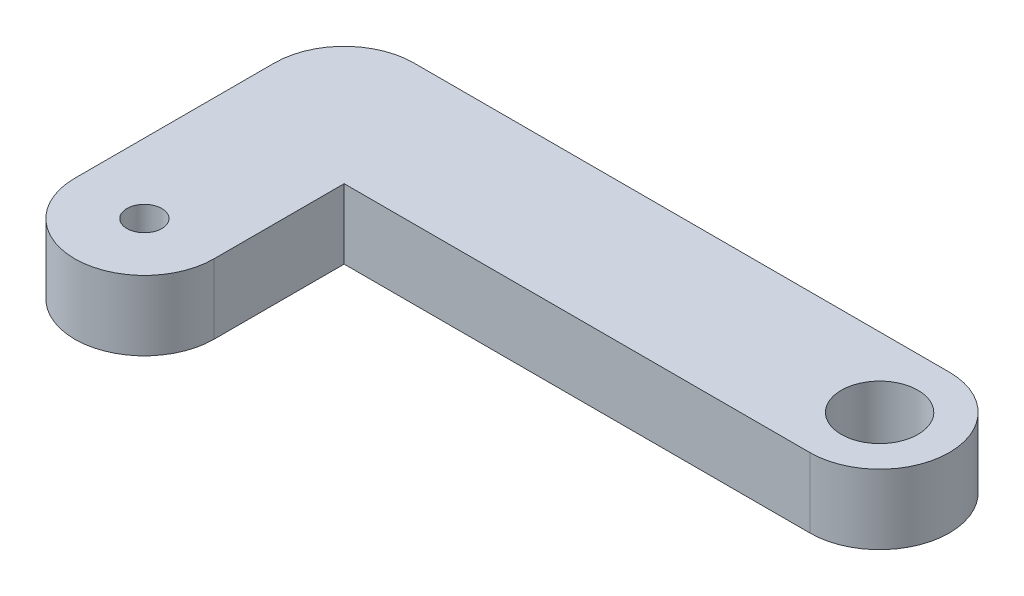
ISO-10303-21;
HEADER;
FILE_DESCRIPTION(('STEP AP214'),'2;1');
FILE_NAME('part.step','',(''),(''),'','','');
FILE_SCHEMA(('AUTOMOTIVE_DESIGN { 1 0 10303 214 1 1 1 1 }'));
ENDSEC;
DATA;
#1=APPLICATION_CONTEXT('core data for automotive mechanical design processes');
#2=APPLICATION_PROTOCOL_DEFINITION('international standard','automotive_design',2000,#1);
#3=PRODUCT_CONTEXT('',#1,'mechanical');
#4=PRODUCT('Part','Part','',(#3));
#5=PRODUCT_RELATED_PRODUCT_CATEGORY('part','',(#4));
#6=PRODUCT_DEFINITION_FORMATION('','',#4);
#7=PRODUCT_DEFINITION_CONTEXT('part definition',#1,'design');
#8=PRODUCT_DEFINITION('design','',#6,#7);
#9=PRODUCT_DEFINITION_SHAPE('','',#8);
#10=(LENGTH_UNIT() NAMED_UNIT(*) SI_UNIT(.MILLI.,.METRE.));
#11=(NAMED_UNIT(*) PLANE_ANGLE_UNIT() SI_UNIT($,.RADIAN.));
#12=(NAMED_UNIT(*) SI_UNIT($,.STERADIAN.) SOLID_ANGLE_UNIT());
#13=UNCERTAINTY_MEASURE_WITH_UNIT(LENGTH_MEASURE(1.E-05),#10,'distance_accuracy_value','');
#14=(GEOMETRIC_REPRESENTATION_CONTEXT(3) GLOBAL_UNCERTAINTY_ASSIGNED_CONTEXT((#13)) GLOBAL_UNIT_ASSIGNED_CONTEXT((#10,
#11,#12)) REPRESENTATION_CONTEXT('',''));
#15=CARTESIAN_POINT('',(0.,0.,0.));
#16=DIRECTION('',(0.,0.,1.));
#17=DIRECTION('',(1.,0.,0.));
#18=AXIS2_PLACEMENT_3D('',#15,#16,#17);
#19=CARTESIAN_POINT('',(0.,3.,0.));
#20=DIRECTION('',(0.,-1.,0.));
#21=DIRECTION('',(0.,0.,-1.));
#22=AXIS2_PLACEMENT_3D('',#19,#20,#21);
#23=CYLINDRICAL_SURFACE('',#22,3.);
#24=DIRECTION('',(0.,-1.,0.));
#25=VECTOR('',#24,1.);
#26=CARTESIAN_POINT('',(-3.,18.7848028179005,0.));
#27=LINE('',#26,#25);
#28=CARTESIAN_POINT('',(-3.,3.,0.));
#29=VERTEX_POINT('',#28);
#30=CARTESIAN_POINT('',(-3.,0.,0.));
#31=VERTEX_POINT('',#30);
#32=EDGE_CURVE('E127',#29,#31,#27,.T.);
#33=ORIENTED_EDGE('',*,*,#32,.F.);
#34=CARTESIAN_POINT('',(0.,3.,0.));
#35=DIRECTION('',(0.,1.,0.));
#36=DIRECTION('',(0.,0.,1.));
#37=AXIS2_PLACEMENT_3D('',#34,#35,#36);
#38=CIRCLE('',#37,3.);
#39=CARTESIAN_POINT('',(0.,3.,-3.));
#40=VERTEX_POINT('',#39);
#41=EDGE_CURVE('E135',#40,#29,#38,.T.);
#42=ORIENTED_EDGE('',*,*,#41,.F.);
#43=DIRECTION('',(0.,-1.,0.));
#44=VECTOR('',#43,1.);
#45=CARTESIAN_POINT('',(0.,3.,-3.));
#46=LINE('',#45,#44);
#47=CARTESIAN_POINT('',(0.,0.,-3.));
#48=VERTEX_POINT('',#47);
#49=EDGE_CURVE('E141',#40,#48,#46,.T.);
#50=ORIENTED_EDGE('',*,*,#49,.T.);
#51=CARTESIAN_POINT('',(0.,0.,0.));
#52=DIRECTION('',(0.,1.,0.));
#53=DIRECTION('',(0.,0.,1.));
#54=AXIS2_PLACEMENT_3D('',#51,#52,#53);
#55=CIRCLE('',#54,3.);
#56=EDGE_CURVE('E133',#48,#31,#55,.T.);
#57=ORIENTED_EDGE('',*,*,#56,.T.);
#58=EDGE_LOOP('',(#33,#42,#50,#57));
#59=FACE_BOUND('',#58,.T.);
#60=ADVANCED_FACE('F35',(#59),#23,.T.);
#61=CARTESIAN_POINT('',(0.,3.,3.));
#62=DIRECTION('',(0.,0.,-1.));
#63=DIRECTION('',(-1.,0.,0.));
#64=AXIS2_PLACEMENT_3D('',#61,#62,#63);
#65=PLANE('',#64);
#66=DIRECTION('',(0.,1.,0.));
#67=VECTOR('',#66,1.);
#68=CARTESIAN_POINT('',(3.,3.,3.));
#69=LINE('',#68,#67);
#70=CARTESIAN_POINT('',(3.,0.,3.));
#71=VERTEX_POINT('',#70);
#72=CARTESIAN_POINT('',(3.,3.,3.));
#73=VERTEX_POINT('',#72);
#74=EDGE_CURVE('E11',#71,#73,#69,.T.);
#75=ORIENTED_EDGE('',*,*,#74,.F.);
#76=DIRECTION('',(1.,0.,0.));
#77=VECTOR('',#76,1.);
#78=CARTESIAN_POINT('',(0.,0.,3.));
#79=LINE('',#78,#77);
#80=CARTESIAN_POINT('',(23.05,0.,3.));
#81=VERTEX_POINT('',#80);
#82=EDGE_CURVE('E144',#71,#81,#79,.T.);
#83=ORIENTED_EDGE('',*,*,#82,.T.);
#84=DIRECTION('',(0.,-1.,0.));
#85=VECTOR('',#84,1.);
#86=CARTESIAN_POINT('',(23.05,3.,3.));
#87=LINE('',#86,#85);
#88=CARTESIAN_POINT('',(23.05,3.,3.));
#89=VERTEX_POINT('',#88);
#90=EDGE_CURVE('E42',#89,#81,#87,.T.);
#91=ORIENTED_EDGE('',*,*,#90,.F.);
#92=DIRECTION('',(1.,0.,0.));
#93=VECTOR('',#92,1.);
#94=CARTESIAN_POINT('',(0.,3.,3.));
#95=LINE('',#94,#93);
#96=EDGE_CURVE('E76',#73,#89,#95,.T.);
#97=ORIENTED_EDGE('',*,*,#96,.F.);
#98=EDGE_LOOP('',(#75,#83,#91,#97));
#99=FACE_BOUND('',#98,.T.);
#100=ADVANCED_FACE('F181',(#99),#65,.F.);
#101=CARTESIAN_POINT('',(0.,3.,0.));
#102=DIRECTION('',(0.,1.,0.));
#103=DIRECTION('',(0.,0.,1.));
#104=AXIS2_PLACEMENT_3D('',#101,#102,#103);
#105=PLANE('',#104);
#106=CARTESIAN_POINT('',(0.,3.,8.6));
#107=DIRECTION('',(0.,1.,0.));
#108=DIRECTION('',(0.,0.,1.));
#109=AXIS2_PLACEMENT_3D('',#106,#107,#108);
#110=CIRCLE('',#109,0.75);
#111=CARTESIAN_POINT('',(0.,3.,9.35));
#112=VERTEX_POINT('',#111);
#113=EDGE_CURVE('E211',#112,#112,#110,.T.);
#114=ORIENTED_EDGE('',*,*,#113,.F.);
#115=EDGE_LOOP('',(#114));
#116=FACE_BOUND('',#115,.T.);
#117=DIRECTION('',(-1.,0.,0.));
#118=VECTOR('',#117,1.);
#119=CARTESIAN_POINT('',(0.,3.,-3.));
#120=LINE('',#119,#118);
#121=CARTESIAN_POINT('',(23.05,3.,-3.));
#122=VERTEX_POINT('',#121);
#123=EDGE_CURVE('E56',#122,#40,#120,.T.);
#124=ORIENTED_EDGE('',*,*,#123,.T.);
#125=ORIENTED_EDGE('',*,*,#41,.T.);
#126=DIRECTION('',(0.,0.,1.));
#127=VECTOR('',#126,1.);
#128=CARTESIAN_POINT('',(-3.,3.,0.));
#129=LINE('',#128,#127);
#130=CARTESIAN_POINT('',(-3.,3.,8.6));
#131=VERTEX_POINT('',#130);
#132=EDGE_CURVE('E112',#29,#131,#129,.T.);
#133=ORIENTED_EDGE('',*,*,#132,.T.);
#134=CARTESIAN_POINT('',(0.,3.,8.6));
#135=DIRECTION('',(0.,1.,0.));
#136=DIRECTION('',(0.,0.,1.));
#137=AXIS2_PLACEMENT_3D('',#134,#135,#136);
#138=CIRCLE('',#137,3.);
#139=CARTESIAN_POINT('',(3.,3.,8.6));
#140=VERTEX_POINT('',#139);
#141=EDGE_CURVE('E102',#131,#140,#138,.T.);
#142=ORIENTED_EDGE('',*,*,#141,.T.);
#143=DIRECTION('',(0.,0.,-1.));
#144=VECTOR('',#143,1.);
#145=CARTESIAN_POINT('',(3.,3.,0.));
#146=LINE('',#145,#144);
#147=EDGE_CURVE('E49',#140,#73,#146,.T.);
#148=ORIENTED_EDGE('',*,*,#147,.T.);
#149=ORIENTED_EDGE('',*,*,#96,.T.);
#150=CARTESIAN_POINT('',(23.05,3.,0.));
#151=DIRECTION('',(0.,1.,0.));
#152=DIRECTION('',(0.,0.,1.));
#153=AXIS2_PLACEMENT_3D('',#150,#151,#152);
#154=CIRCLE('',#153,3.);
#155=EDGE_CURVE('E138',#89,#122,#154,.T.);
#156=ORIENTED_EDGE('',*,*,#155,.T.);
#157=EDGE_LOOP('',(#124,#125,#133,#142,#148,#149,#156));
#158=FACE_BOUND('',#157,.T.);
#159=CARTESIAN_POINT('',(23.05,3.,0.));
#160=DIRECTION('',(0.,1.,0.));
#161=DIRECTION('',(0.,0.,1.));
#162=AXIS2_PLACEMENT_3D('',#159,#160,#161);
#163=CIRCLE('',#162,1.65);
#164=CARTESIAN_POINT('',(23.05,3.,1.65));
#165=VERTEX_POINT('',#164);
#166=EDGE_CURVE('E120',#165,#165,#163,.T.);
#167=ORIENTED_EDGE('',*,*,#166,.F.);
#168=EDGE_LOOP('',(#167));
#169=FACE_BOUND('',#168,.T.);
#170=ADVANCED_FACE('F115',(#116,#158,#169),#105,.T.);
#171=CARTESIAN_POINT('',(0.,0.,0.));
#172=DIRECTION('',(0.,1.,0.));
#173=DIRECTION('',(0.,0.,1.));
#174=AXIS2_PLACEMENT_3D('',#171,#172,#173);
#175=PLANE('',#174);
#176=CARTESIAN_POINT('',(0.,0.,8.6));
#177=DIRECTION('',(0.,1.,0.));
#178=DIRECTION('',(0.,0.,1.));
#179=AXIS2_PLACEMENT_3D('',#176,#177,#178);
#180=CIRCLE('',#179,0.75);
#181=CARTESIAN_POINT('',(0.,0.,9.35));
#182=VERTEX_POINT('',#181);
#183=EDGE_CURVE('E129',#182,#182,#180,.F.);
#184=ORIENTED_EDGE('',*,*,#183,.F.);
#185=EDGE_LOOP('',(#184));
#186=FACE_BOUND('',#185,.T.);
#187=ORIENTED_EDGE('',*,*,#56,.F.);
#188=DIRECTION('',(-1.,0.,0.));
#189=VECTOR('',#188,1.);
#190=CARTESIAN_POINT('',(0.,0.,-3.));
#191=LINE('',#190,#189);
#192=CARTESIAN_POINT('',(23.05,0.,-3.));
#193=VERTEX_POINT('',#192);
#194=EDGE_CURVE('E73',#193,#48,#191,.T.);
#195=ORIENTED_EDGE('',*,*,#194,.F.);
#196=CARTESIAN_POINT('',(23.05,0.,0.));
#197=DIRECTION('',(0.,1.,0.));
#198=DIRECTION('',(0.,0.,1.));
#199=AXIS2_PLACEMENT_3D('',#196,#197,#198);
#200=CIRCLE('',#199,3.);
#201=EDGE_CURVE('E146',#81,#193,#200,.T.);
#202=ORIENTED_EDGE('',*,*,#201,.F.);
#203=ORIENTED_EDGE('',*,*,#82,.F.);
#204=DIRECTION('',(0.,0.,-1.));
#205=VECTOR('',#204,1.);
#206=CARTESIAN_POINT('',(3.,0.,0.));
#207=LINE('',#206,#205);
#208=CARTESIAN_POINT('',(3.,0.,8.6));
#209=VERTEX_POINT('',#208);
#210=EDGE_CURVE('E108',#209,#71,#207,.T.);
#211=ORIENTED_EDGE('',*,*,#210,.F.);
#212=CARTESIAN_POINT('',(0.,0.,8.6));
#213=DIRECTION('',(0.,1.,0.));
#214=DIRECTION('',(0.,0.,1.));
#215=AXIS2_PLACEMENT_3D('',#212,#213,#214);
#216=CIRCLE('',#215,3.);
#217=CARTESIAN_POINT('',(-3.,0.,8.6));
#218=VERTEX_POINT('',#217);
#219=EDGE_CURVE('E105',#218,#209,#216,.T.);
#220=ORIENTED_EDGE('',*,*,#219,.F.);
#221=DIRECTION('',(0.,0.,1.));
#222=VECTOR('',#221,1.);
#223=CARTESIAN_POINT('',(-3.,0.,0.));
#224=LINE('',#223,#222);
#225=EDGE_CURVE('E124',#31,#218,#224,.T.);
#226=ORIENTED_EDGE('',*,*,#225,.F.);
#227=EDGE_LOOP('',(#187,#195,#202,#203,#211,#220,#226));
#228=FACE_BOUND('',#227,.T.);
#229=CARTESIAN_POINT('',(23.05,0.,0.));
#230=DIRECTION('',(0.,1.,0.));
#231=DIRECTION('',(0.,0.,1.));
#232=AXIS2_PLACEMENT_3D('',#229,#230,#231);
#233=CIRCLE('',#232,1.65);
#234=CARTESIAN_POINT('',(23.05,0.,1.65));
#235=VERTEX_POINT('',#234);
#236=EDGE_CURVE('E117',#235,#235,#233,.T.);
#237=ORIENTED_EDGE('',*,*,#236,.T.);
#238=EDGE_LOOP('',(#237));
#239=FACE_BOUND('',#238,.T.);
#240=ADVANCED_FACE('F161',(#186,#228,#239),#175,.F.);
#241=CARTESIAN_POINT('',(23.05,3.,0.));
#242=DIRECTION('',(0.,-1.,0.));
#243=DIRECTION('',(0.,0.,-1.));
#244=AXIS2_PLACEMENT_3D('',#241,#242,#243);
#245=CYLINDRICAL_SURFACE('',#244,3.);
#246=ORIENTED_EDGE('',*,*,#201,.T.);
#247=DIRECTION('',(0.,-1.,0.));
#248=VECTOR('',#247,1.);
#249=CARTESIAN_POINT('',(23.05,3.,-3.));
#250=LINE('',#249,#248);
#251=EDGE_CURVE('E150',#122,#193,#250,.T.);
#252=ORIENTED_EDGE('',*,*,#251,.F.);
#253=ORIENTED_EDGE('',*,*,#155,.F.);
#254=ORIENTED_EDGE('',*,*,#90,.T.);
#255=EDGE_LOOP('',(#246,#252,#253,#254));
#256=FACE_BOUND('',#255,.T.);
#257=ADVANCED_FACE('F155',(#256),#245,.T.);
#258=CARTESIAN_POINT('',(0.,3.,-3.));
#259=DIRECTION('',(0.,0.,1.));
#260=DIRECTION('',(1.,0.,0.));
#261=AXIS2_PLACEMENT_3D('',#258,#259,#260);
#262=PLANE('',#261);
#263=ORIENTED_EDGE('',*,*,#194,.T.);
#264=ORIENTED_EDGE('',*,*,#49,.F.);
#265=ORIENTED_EDGE('',*,*,#123,.F.);
#266=ORIENTED_EDGE('',*,*,#251,.T.);
#267=EDGE_LOOP('',(#263,#264,#265,#266));
#268=FACE_BOUND('',#267,.T.);
#269=ADVANCED_FACE('F168',(#268),#262,.F.);
#270=CARTESIAN_POINT('',(23.05,3.,0.));
#271=DIRECTION('',(0.,-1.,0.));
#272=DIRECTION('',(0.,0.,-1.));
#273=AXIS2_PLACEMENT_3D('',#270,#271,#272);
#274=CYLINDRICAL_SURFACE('',#273,1.65);
#275=ORIENTED_EDGE('',*,*,#166,.T.);
#276=EDGE_LOOP('',(#275));
#277=FACE_BOUND('',#276,.T.);
#278=ORIENTED_EDGE('',*,*,#236,.F.);
#279=EDGE_LOOP('',(#278));
#280=FACE_BOUND('',#279,.T.);
#281=ADVANCED_FACE('F170',(#277,#280),#274,.F.);
#282=CARTESIAN_POINT('',(3.,18.7848028179005,0.));
#283=DIRECTION('',(-1.,0.,0.));
#284=DIRECTION('',(0.,0.,1.));
#285=AXIS2_PLACEMENT_3D('',#282,#283,#284);
#286=PLANE('',#285);
#287=ORIENTED_EDGE('',*,*,#210,.T.);
#288=ORIENTED_EDGE('',*,*,#74,.T.);
#289=ORIENTED_EDGE('',*,*,#147,.F.);
#290=DIRECTION('',(0.,-1.,0.));
#291=VECTOR('',#290,1.);
#292=CARTESIAN_POINT('',(3.,18.7848028179005,8.6));
#293=LINE('',#292,#291);
#294=EDGE_CURVE('E100',#140,#209,#293,.T.);
#295=ORIENTED_EDGE('',*,*,#294,.T.);
#296=EDGE_LOOP('',(#287,#288,#289,#295));
#297=FACE_BOUND('',#296,.T.);
#298=ADVANCED_FACE('F110',(#297),#286,.F.);
#299=CARTESIAN_POINT('',(-3.,18.7848028179005,0.));
#300=DIRECTION('',(1.,0.,0.));
#301=DIRECTION('',(0.,0.,-1.));
#302=AXIS2_PLACEMENT_3D('',#299,#300,#301);
#303=PLANE('',#302);
#304=ORIENTED_EDGE('',*,*,#132,.F.);
#305=ORIENTED_EDGE('',*,*,#32,.T.);
#306=ORIENTED_EDGE('',*,*,#225,.T.);
#307=DIRECTION('',(0.,-1.,0.));
#308=VECTOR('',#307,1.);
#309=CARTESIAN_POINT('',(-3.,18.7848028179005,8.6));
#310=LINE('',#309,#308);
#311=EDGE_CURVE('E130',#131,#218,#310,.T.);
#312=ORIENTED_EDGE('',*,*,#311,.F.);
#313=EDGE_LOOP('',(#304,#305,#306,#312));
#314=FACE_BOUND('',#313,.T.);
#315=ADVANCED_FACE('F196',(#314),#303,.F.);
#316=CARTESIAN_POINT('',(0.,18.7848028179005,8.6));
#317=DIRECTION('',(0.,-1.,0.));
#318=DIRECTION('',(0.,0.,-1.));
#319=AXIS2_PLACEMENT_3D('',#316,#317,#318);
#320=CYLINDRICAL_SURFACE('',#319,3.);
#321=ORIENTED_EDGE('',*,*,#141,.F.);
#322=ORIENTED_EDGE('',*,*,#311,.T.);
#323=ORIENTED_EDGE('',*,*,#219,.T.);
#324=ORIENTED_EDGE('',*,*,#294,.F.);
#325=EDGE_LOOP('',(#321,#322,#323,#324));
#326=FACE_BOUND('',#325,.T.);
#327=ADVANCED_FACE('F101',(#326),#320,.T.);
#328=CARTESIAN_POINT('',(0.,-0.00100000000000013,8.6));
#329=DIRECTION('',(0.,1.,0.));
#330=DIRECTION('',(0.,0.,1.));
#331=AXIS2_PLACEMENT_3D('',#328,#329,#330);
#332=CYLINDRICAL_SURFACE('',#331,0.75);
#333=CARTESIAN_POINT('',(0.,3.,9.35));
#334=CARTESIAN_POINT('',(0.,2.96875,9.35));
#335=CARTESIAN_POINT('',(0.,2.9375,9.35));
#336=CARTESIAN_POINT('',(0.,2.875,9.35));
#337=CARTESIAN_POINT('',(0.,2.84375,9.35));
#338=CARTESIAN_POINT('',(0.,2.78125,9.35));
#339=CARTESIAN_POINT('',(0.,2.75,9.35));
#340=CARTESIAN_POINT('',(0.,2.6875,9.35));
#341=CARTESIAN_POINT('',(0.,2.65625,9.35));
#342=CARTESIAN_POINT('',(0.,2.59375,9.35));
#343=CARTESIAN_POINT('',(0.,2.5625,9.35));
#344=CARTESIAN_POINT('',(0.,2.5,9.35));
#345=CARTESIAN_POINT('',(0.,2.46875,9.35));
#346=CARTESIAN_POINT('',(0.,2.40625,9.35));
#347=CARTESIAN_POINT('',(0.,2.375,9.35));
#348=CARTESIAN_POINT('',(0.,2.3125,9.35));
#349=CARTESIAN_POINT('',(0.,2.28125,9.35));
#350=CARTESIAN_POINT('',(0.,2.21875,9.35));
#351=CARTESIAN_POINT('',(0.,2.1875,9.35));
#352=CARTESIAN_POINT('',(0.,2.125,9.35));
#353=CARTESIAN_POINT('',(0.,2.09375,9.35));
#354=CARTESIAN_POINT('',(0.,2.03125,9.35));
#355=CARTESIAN_POINT('',(0.,2.,9.35));
#356=CARTESIAN_POINT('',(0.,1.9375,9.35));
#357=CARTESIAN_POINT('',(0.,1.90625,9.35));
#358=CARTESIAN_POINT('',(0.,1.84375,9.35));
#359=CARTESIAN_POINT('',(0.,1.8125,9.35));
#360=CARTESIAN_POINT('',(0.,1.75,9.35));
#361=CARTESIAN_POINT('',(0.,1.71875,9.35));
#362=CARTESIAN_POINT('',(0.,1.65625,9.35));
#363=CARTESIAN_POINT('',(0.,1.625,9.35));
#364=CARTESIAN_POINT('',(0.,1.5625,9.35));
#365=CARTESIAN_POINT('',(0.,1.53125,9.35));
#366=CARTESIAN_POINT('',(0.,1.46875,9.35));
#367=CARTESIAN_POINT('',(0.,1.4375,9.35));
#368=CARTESIAN_POINT('',(0.,1.375,9.35));
#369=CARTESIAN_POINT('',(0.,1.34375,9.35));
#370=CARTESIAN_POINT('',(0.,1.28125,9.35));
#371=CARTESIAN_POINT('',(0.,1.25,9.35));
#372=CARTESIAN_POINT('',(0.,1.1875,9.35));
#373=CARTESIAN_POINT('',(0.,1.15625,9.35));
#374=CARTESIAN_POINT('',(0.,1.09375,9.35));
#375=CARTESIAN_POINT('',(0.,1.0625,9.35));
#376=CARTESIAN_POINT('',(0.,1.,9.35));
#377=CARTESIAN_POINT('',(0.,0.96875,9.35));
#378=CARTESIAN_POINT('',(0.,0.90625,9.35));
#379=CARTESIAN_POINT('',(0.,0.875,9.35));
#380=CARTESIAN_POINT('',(0.,0.8125,9.35));
#381=CARTESIAN_POINT('',(0.,0.78125,9.35));
#382=CARTESIAN_POINT('',(0.,0.71875,9.35));
#383=CARTESIAN_POINT('',(0.,0.6875,9.35));
#384=CARTESIAN_POINT('',(0.,0.625,9.35));
#385=CARTESIAN_POINT('',(0.,0.59375,9.35));
#386=CARTESIAN_POINT('',(0.,0.53125,9.35));
#387=CARTESIAN_POINT('',(0.,0.5,9.35));
#388=CARTESIAN_POINT('',(0.,0.4375,9.35));
#389=CARTESIAN_POINT('',(0.,0.40625,9.35));
#390=CARTESIAN_POINT('',(0.,0.34375,9.35));
#391=CARTESIAN_POINT('',(0.,0.3125,9.35));
#392=CARTESIAN_POINT('',(0.,0.25,9.35));
#393=CARTESIAN_POINT('',(0.,0.21875,9.35));
#394=CARTESIAN_POINT('',(0.,0.15625,9.35));
#395=CARTESIAN_POINT('',(0.,0.125,9.35));
#396=CARTESIAN_POINT('',(0.,0.0625000000000001,9.35));
#397=CARTESIAN_POINT('',(0.,0.0312500000000001,9.35));
#398=CARTESIAN_POINT('',(0.,0.,9.35));
#399=B_SPLINE_CURVE_WITH_KNOTS('',3,(#333,#334,#335,#336,#337,#338,#339,#340,#341,#342,#343,
#344,#345,#346,#347,#348,#349,#350,#351,#352,#353,#354,#355,#356,#357,#358,#359,#360,#361,#362,
#363,#364,#365,#366,#367,#368,#369,#370,#371,#372,#373,#374,#375,#376,#377,#378,#379,#380,#381,
#382,#383,#384,#385,#386,#387,#388,#389,#390,#391,#392,#393,#394,#395,#396,#397,#398),
.UNSPECIFIED.,.F.,.F.,(4,2,2,2,2,2,2,2,2,2,2,2,2,2,2,2,2,2,2,2,2,2,2,2,2,2,2,2,2,2,2,2,4),(0.,
0.0937500000000001,0.1875,0.28125,0.375,0.46875,0.5625,0.65625,0.75,0.84375,0.9375,1.03125,
1.125,1.21875,1.3125,1.40625,1.5,1.59375,1.6875,1.78125,1.875,1.96875,2.0625,2.15625,2.25,
2.34375,2.4375,2.53125,2.625,2.71875,2.8125,2.90625,3.),.UNSPECIFIED.);
#400=EDGE_CURVE('BSEAM202',#112,#182,#399,.T.);
#401=ORIENTED_EDGE('',*,*,#113,.T.);
#402=ORIENTED_EDGE('',*,*,#183,.T.);
#403=ORIENTED_EDGE('',*,*,#400,.T.);
#404=ORIENTED_EDGE('',*,*,#400,.F.);
#405=EDGE_LOOP('',(#401,#403,#402,#404));
#406=FACE_BOUND('',#405,.T.);
#407=ADVANCED_FACE('F202',(#406),#332,.F.);
#408=CLOSED_SHELL('',(#60,#100,#170,#240,#257,#269,#281,#298,#315,#327,#407));
#409=MANIFOLD_SOLID_BREP('B2',#408);
#410=ADVANCED_BREP_SHAPE_REPRESENTATION('',(#18,#409),#14);
#411=SHAPE_DEFINITION_REPRESENTATION(#9,#410);
ENDSEC;
END-ISO-10303-21;
